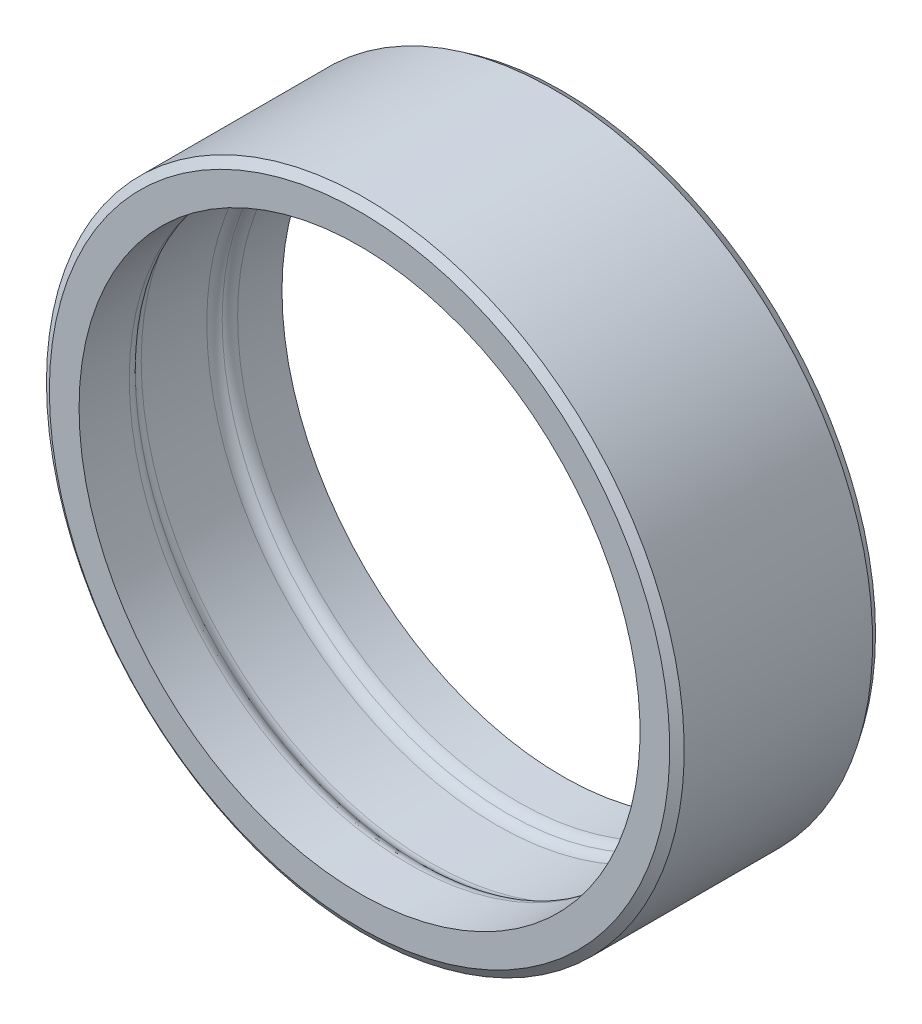
ISO-10303-21;
HEADER;
FILE_DESCRIPTION(('STEP AP214'),'2;1');
FILE_NAME('part.step','',(''),(''),'','','');
FILE_SCHEMA(('AUTOMOTIVE_DESIGN { 1 0 10303 214 1 1 1 1 }'));
ENDSEC;
DATA;
#1=APPLICATION_CONTEXT('core data for automotive mechanical design processes');
#2=APPLICATION_PROTOCOL_DEFINITION('international standard','automotive_design',2000,#1);
#3=PRODUCT_CONTEXT('',#1,'mechanical');
#4=PRODUCT('Part','Part','',(#3));
#5=PRODUCT_RELATED_PRODUCT_CATEGORY('part','',(#4));
#6=PRODUCT_DEFINITION_FORMATION('','',#4);
#7=PRODUCT_DEFINITION_CONTEXT('part definition',#1,'design');
#8=PRODUCT_DEFINITION('design','',#6,#7);
#9=PRODUCT_DEFINITION_SHAPE('','',#8);
#10=(LENGTH_UNIT() NAMED_UNIT(*) SI_UNIT(.MILLI.,.METRE.));
#11=(NAMED_UNIT(*) PLANE_ANGLE_UNIT() SI_UNIT($,.RADIAN.));
#12=(NAMED_UNIT(*) SI_UNIT($,.STERADIAN.) SOLID_ANGLE_UNIT());
#13=UNCERTAINTY_MEASURE_WITH_UNIT(LENGTH_MEASURE(1.E-05),#10,'distance_accuracy_value','');
#14=(GEOMETRIC_REPRESENTATION_CONTEXT(3) GLOBAL_UNCERTAINTY_ASSIGNED_CONTEXT((#13)) GLOBAL_UNIT_ASSIGNED_CONTEXT((#10,
#11,#12)) REPRESENTATION_CONTEXT('',''));
#15=CARTESIAN_POINT('',(0.,0.,0.));
#16=DIRECTION('',(0.,0.,1.));
#17=DIRECTION('',(1.,0.,0.));
#18=AXIS2_PLACEMENT_3D('',#15,#16,#17);
#19=CARTESIAN_POINT('',(0.,0.,0.));
#20=DIRECTION('',(0.,0.,-1.));
#21=DIRECTION('',(1.,0.,0.));
#22=AXIS2_PLACEMENT_3D('',#19,#20,#21);
#23=CYLINDRICAL_SURFACE('',#22,9.675);
#24=CARTESIAN_POINT('',(0.,0.,-7.));
#25=DIRECTION('',(0.,0.,-1.));
#26=DIRECTION('',(1.,0.,0.));
#27=AXIS2_PLACEMENT_3D('',#24,#25,#26);
#28=CIRCLE('',#27,9.675);
#29=CARTESIAN_POINT('',(-9.675,0.,-7.));
#30=VERTEX_POINT('',#29);
#31=EDGE_CURVE('E156',#30,#30,#28,.T.);
#32=ORIENTED_EDGE('',*,*,#31,.T.);
#33=DIRECTION('',(0.,0.,1.));
#34=VECTOR('',#33,1.);
#35=CARTESIAN_POINT('',(-9.675,0.,0.));
#36=LINE('',#35,#34);
#37=CARTESIAN_POINT('',(-9.675,0.,-5.46837484987988));
#38=VERTEX_POINT('',#37);
#39=EDGE_CURVE('E11',#30,#38,#36,.T.);
#40=ORIENTED_EDGE('',*,*,#39,.T.);
#41=CARTESIAN_POINT('',(0.,0.,-5.46837484987988));
#42=DIRECTION('',(0.,0.,1.));
#43=DIRECTION('',(-1.,0.,0.));
#44=AXIS2_PLACEMENT_3D('',#41,#42,#43);
#45=CIRCLE('',#44,9.675);
#46=CARTESIAN_POINT('',(9.675,0.,-5.46837484987988));
#47=VERTEX_POINT('',#46);
#48=EDGE_CURVE('E215',#38,#47,#45,.T.);
#49=ORIENTED_EDGE('',*,*,#48,.T.);
#50=CARTESIAN_POINT('',(0.,0.,-5.46837484987988));
#51=DIRECTION('',(0.,0.,1.));
#52=DIRECTION('',(-1.,0.,0.));
#53=AXIS2_PLACEMENT_3D('',#50,#51,#52);
#54=CIRCLE('',#53,9.675);
#55=EDGE_CURVE('E69',#47,#38,#54,.T.);
#56=ORIENTED_EDGE('',*,*,#55,.T.);
#57=ORIENTED_EDGE('',*,*,#39,.F.);
#58=EDGE_LOOP('',(#32,#40,#49,#56,#57));
#59=FACE_BOUND('',#58,.T.);
#60=ADVANCED_FACE('F47',(#59),#23,.F.);
#61=CARTESIAN_POINT('',(0.,0.,-5.46837484987988));
#62=DIRECTION('',(0.,0.,1.));
#63=DIRECTION('',(-1.,0.,0.));
#64=AXIS2_PLACEMENT_3D('',#61,#62,#63);
#65=TOROIDAL_SURFACE('',#64,10.175,0.5);
#66=ORIENTED_EDGE('',*,*,#55,.F.);
#67=CARTESIAN_POINT('',(10.175,0.,-5.46837484987988));
#68=DIRECTION('',(0.,1.,0.));
#69=DIRECTION('',(1.,0.,0.));
#70=AXIS2_PLACEMENT_3D('',#67,#68,#69);
#71=CIRCLE('',#70,0.5);
#72=CARTESIAN_POINT('',(9.8375,0.,-5.09946598579554));
#73=VERTEX_POINT('',#72);
#74=EDGE_CURVE('E59',#47,#73,#71,.T.);
#75=ORIENTED_EDGE('',*,*,#74,.T.);
#76=CARTESIAN_POINT('',(0.,0.,-5.09946598579554));
#77=DIRECTION('',(0.,0.,1.));
#78=DIRECTION('',(1.,0.,0.));
#79=AXIS2_PLACEMENT_3D('',#76,#77,#78);
#80=CIRCLE('',#79,9.8375);
#81=CARTESIAN_POINT('',(-9.8375,0.,-5.09946598579554));
#82=VERTEX_POINT('',#81);
#83=EDGE_CURVE('E205',#73,#82,#80,.T.);
#84=ORIENTED_EDGE('',*,*,#83,.T.);
#85=CARTESIAN_POINT('',(0.,0.,-5.09946598579554));
#86=DIRECTION('',(0.,0.,1.));
#87=DIRECTION('',(1.,0.,0.));
#88=AXIS2_PLACEMENT_3D('',#85,#86,#87);
#89=CIRCLE('',#88,9.8375);
#90=EDGE_CURVE('E204',#82,#73,#89,.T.);
#91=ORIENTED_EDGE('',*,*,#90,.T.);
#92=ORIENTED_EDGE('',*,*,#74,.F.);
#93=ORIENTED_EDGE('',*,*,#48,.F.);
#94=EDGE_LOOP('',(#66,#75,#84,#91,#92,#93));
#95=FACE_BOUND('',#94,.T.);
#96=ADVANCED_FACE('F217',(#95),#65,.T.);
#97=CARTESIAN_POINT('',(0.,0.,-4.7305571217112));
#98=DIRECTION('',(0.,0.,-1.));
#99=DIRECTION('',(1.,0.,0.));
#100=AXIS2_PLACEMENT_3D('',#97,#98,#99);
#101=TOROIDAL_SURFACE('',#100,9.5,0.5);
#102=ORIENTED_EDGE('',*,*,#90,.F.);
#103=CARTESIAN_POINT('',(-9.5,0.,-4.7305571217112));
#104=DIRECTION('',(0.,1.,0.));
#105=DIRECTION('',(-1.,0.,0.));
#106=AXIS2_PLACEMENT_3D('',#103,#104,#105);
#107=CIRCLE('',#106,0.5);
#108=CARTESIAN_POINT('',(-10.,0.,-4.7305571217112));
#109=VERTEX_POINT('',#108);
#110=EDGE_CURVE('E199',#82,#109,#107,.T.);
#111=ORIENTED_EDGE('',*,*,#110,.T.);
#112=CARTESIAN_POINT('',(0.,0.,-4.7305571217112));
#113=DIRECTION('',(0.,0.,-1.));
#114=DIRECTION('',(1.,0.,0.));
#115=AXIS2_PLACEMENT_3D('',#112,#113,#114);
#116=CIRCLE('',#115,10.);
#117=EDGE_CURVE('E142',#109,#109,#116,.T.);
#118=ORIENTED_EDGE('',*,*,#117,.F.);
#119=ORIENTED_EDGE('',*,*,#110,.F.);
#120=ORIENTED_EDGE('',*,*,#83,.F.);
#121=EDGE_LOOP('',(#102,#111,#118,#119,#120));
#122=FACE_BOUND('',#121,.T.);
#123=ADVANCED_FACE('F222',(#122),#101,.F.);
#124=CARTESIAN_POINT('',(0.,0.,-3.5));
#125=DIRECTION('',(0.,0.,-1.));
#126=DIRECTION('',(1.,0.,0.));
#127=AXIS2_PLACEMENT_3D('',#124,#125,#126);
#128=CYLINDRICAL_SURFACE('',#127,10.);
#129=CARTESIAN_POINT('',(0.,0.,-2.46837484987988));
#130=DIRECTION('',(0.,0.,1.));
#131=DIRECTION('',(-1.,0.,0.));
#132=AXIS2_PLACEMENT_3D('',#129,#130,#131);
#133=CIRCLE('',#132,10.);
#134=CARTESIAN_POINT('',(10.,0.,-2.46837484987988));
#135=VERTEX_POINT('',#134);
#136=CARTESIAN_POINT('',(-10.,0.,-2.46837484987988));
#137=VERTEX_POINT('',#136);
#138=EDGE_CURVE('E132',#135,#137,#133,.T.);
#139=ORIENTED_EDGE('',*,*,#138,.T.);
#140=DIRECTION('',(0.,0.,-1.));
#141=VECTOR('',#140,1.);
#142=CARTESIAN_POINT('',(-10.,0.,-3.5));
#143=LINE('',#142,#141);
#144=EDGE_CURVE('E139',#137,#109,#143,.T.);
#145=ORIENTED_EDGE('',*,*,#144,.T.);
#146=ORIENTED_EDGE('',*,*,#117,.T.);
#147=ORIENTED_EDGE('',*,*,#144,.F.);
#148=CARTESIAN_POINT('',(0.,0.,-2.46837484987988));
#149=DIRECTION('',(0.,0.,1.));
#150=DIRECTION('',(-1.,0.,0.));
#151=AXIS2_PLACEMENT_3D('',#148,#149,#150);
#152=CIRCLE('',#151,10.);
#153=EDGE_CURVE('E129',#137,#135,#152,.T.);
#154=ORIENTED_EDGE('',*,*,#153,.T.);
#155=EDGE_LOOP('',(#139,#145,#146,#147,#154));
#156=FACE_BOUND('',#155,.T.);
#157=ADVANCED_FACE('F141',(#156),#128,.F.);
#158=CARTESIAN_POINT('',(0.,0.,-2.46837484987988));
#159=DIRECTION('',(0.,0.,-1.));
#160=DIRECTION('',(-1.,0.,0.));
#161=AXIS2_PLACEMENT_3D('',#158,#159,#160);
#162=TOROIDAL_SURFACE('',#161,9.5,0.5);
#163=ORIENTED_EDGE('',*,*,#138,.F.);
#164=CARTESIAN_POINT('',(9.5,0.,-2.46837484987988));
#165=DIRECTION('',(0.,-1.,0.));
#166=DIRECTION('',(1.,0.,0.));
#167=AXIS2_PLACEMENT_3D('',#164,#165,#166);
#168=CIRCLE('',#167,0.5);
#169=CARTESIAN_POINT('',(9.8375,0.,-2.09946598579554));
#170=VERTEX_POINT('',#169);
#171=EDGE_CURVE('E134',#135,#170,#168,.T.);
#172=ORIENTED_EDGE('',*,*,#171,.T.);
#173=CARTESIAN_POINT('',(0.,0.,-2.09946598579554));
#174=DIRECTION('',(0.,0.,1.));
#175=DIRECTION('',(1.,0.,0.));
#176=AXIS2_PLACEMENT_3D('',#173,#174,#175);
#177=CIRCLE('',#176,9.8375);
#178=CARTESIAN_POINT('',(-9.8375,0.,-2.09946598579554));
#179=VERTEX_POINT('',#178);
#180=EDGE_CURVE('E153',#170,#179,#177,.T.);
#181=ORIENTED_EDGE('',*,*,#180,.T.);
#182=CARTESIAN_POINT('',(0.,0.,-2.09946598579554));
#183=DIRECTION('',(0.,0.,1.));
#184=DIRECTION('',(1.,0.,0.));
#185=AXIS2_PLACEMENT_3D('',#182,#183,#184);
#186=CIRCLE('',#185,9.8375);
#187=EDGE_CURVE('E189',#179,#170,#186,.T.);
#188=ORIENTED_EDGE('',*,*,#187,.T.);
#189=ORIENTED_EDGE('',*,*,#171,.F.);
#190=ORIENTED_EDGE('',*,*,#153,.F.);
#191=EDGE_LOOP('',(#163,#172,#181,#188,#189,#190));
#192=FACE_BOUND('',#191,.T.);
#193=ADVANCED_FACE('F131',(#192),#162,.F.);
#194=CARTESIAN_POINT('',(0.,0.,0.));
#195=DIRECTION('',(0.,0.,-1.));
#196=DIRECTION('',(1.,0.,0.));
#197=AXIS2_PLACEMENT_3D('',#194,#195,#196);
#198=CYLINDRICAL_SURFACE('',#197,9.675);
#199=CARTESIAN_POINT('',(0.,0.,-1.7305571217112));
#200=DIRECTION('',(0.,0.,-1.));
#201=DIRECTION('',(1.,0.,0.));
#202=AXIS2_PLACEMENT_3D('',#199,#200,#201);
#203=CIRCLE('',#202,9.675);
#204=CARTESIAN_POINT('',(-9.675,0.,-1.7305571217112));
#205=VERTEX_POINT('',#204);
#206=EDGE_CURVE('E158',#205,#205,#203,.T.);
#207=ORIENTED_EDGE('',*,*,#206,.T.);
#208=DIRECTION('',(0.,0.,1.));
#209=VECTOR('',#208,1.);
#210=CARTESIAN_POINT('',(-9.675,0.,0.));
#211=LINE('',#210,#209);
#212=CARTESIAN_POINT('',(-9.675,0.,0.));
#213=VERTEX_POINT('',#212);
#214=EDGE_CURVE('E150',#205,#213,#211,.T.);
#215=ORIENTED_EDGE('',*,*,#214,.T.);
#216=CARTESIAN_POINT('',(0.,0.,0.));
#217=DIRECTION('',(0.,0.,-1.));
#218=DIRECTION('',(1.,0.,0.));
#219=AXIS2_PLACEMENT_3D('',#216,#217,#218);
#220=CIRCLE('',#219,9.675);
#221=EDGE_CURVE('E180',#213,#213,#220,.T.);
#222=ORIENTED_EDGE('',*,*,#221,.F.);
#223=ORIENTED_EDGE('',*,*,#214,.F.);
#224=EDGE_LOOP('',(#207,#215,#222,#223));
#225=FACE_BOUND('',#224,.T.);
#226=ADVANCED_FACE('F267',(#225),#198,.F.);
#227=CARTESIAN_POINT('',(0.,0.,-1.7305571217112));
#228=DIRECTION('',(0.,0.,-1.));
#229=DIRECTION('',(1.,0.,0.));
#230=AXIS2_PLACEMENT_3D('',#227,#228,#229);
#231=TOROIDAL_SURFACE('',#230,10.175,0.5);
#232=ORIENTED_EDGE('',*,*,#206,.F.);
#233=CARTESIAN_POINT('',(-10.175,0.,-1.7305571217112));
#234=DIRECTION('',(0.,1.,0.));
#235=DIRECTION('',(-1.,0.,0.));
#236=AXIS2_PLACEMENT_3D('',#233,#234,#235);
#237=CIRCLE('',#236,0.5);
#238=EDGE_CURVE('E164',#205,#179,#237,.T.);
#239=ORIENTED_EDGE('',*,*,#238,.T.);
#240=ORIENTED_EDGE('',*,*,#180,.F.);
#241=ORIENTED_EDGE('',*,*,#187,.F.);
#242=ORIENTED_EDGE('',*,*,#238,.F.);
#243=EDGE_LOOP('',(#232,#239,#240,#241,#242));
#244=FACE_BOUND('',#243,.T.);
#245=ADVANCED_FACE('F265',(#244),#231,.T.);
#246=CARTESIAN_POINT('',(0.,0.,-7.));
#247=DIRECTION('',(0.,0.,-1.));
#248=DIRECTION('',(1.,0.,0.));
#249=AXIS2_PLACEMENT_3D('',#246,#247,#248);
#250=PLANE('',#249);
#251=ORIENTED_EDGE('',*,*,#31,.F.);
#252=EDGE_LOOP('',(#251));
#253=FACE_BOUND('',#252,.T.);
#254=CARTESIAN_POINT('',(0.,0.,-7.));
#255=DIRECTION('',(0.,0.,-1.));
#256=DIRECTION('',(1.,0.,0.));
#257=AXIS2_PLACEMENT_3D('',#254,#255,#256);
#258=CIRCLE('',#257,10.8);
#259=CARTESIAN_POINT('',(-10.8,0.,-7.));
#260=VERTEX_POINT('',#259);
#261=EDGE_CURVE('E177',#260,#260,#258,.T.);
#262=ORIENTED_EDGE('',*,*,#261,.T.);
#263=EDGE_LOOP('',(#262));
#264=FACE_BOUND('',#263,.T.);
#265=ADVANCED_FACE('F259',(#253,#264),#250,.T.);
#266=CARTESIAN_POINT('',(0.,0.,-6.85));
#267=DIRECTION('',(0.,0.,1.));
#268=DIRECTION('',(1.,0.,0.));
#269=AXIS2_PLACEMENT_3D('',#266,#267,#268);
#270=CONICAL_SURFACE('',#269,10.9,0.588002603547567);
#271=ORIENTED_EDGE('',*,*,#261,.F.);
#272=DIRECTION('',(-0.554700196225229,0.,0.832050294337844));
#273=VECTOR('',#272,1.);
#274=CARTESIAN_POINT('',(-10.9,0.,-6.85));
#275=LINE('',#274,#273);
#276=CARTESIAN_POINT('',(-11.,0.,-6.7));
#277=VERTEX_POINT('',#276);
#278=EDGE_CURVE('E182',#260,#277,#275,.T.);
#279=ORIENTED_EDGE('',*,*,#278,.T.);
#280=CARTESIAN_POINT('',(0.,0.,-6.7));
#281=DIRECTION('',(0.,0.,1.));
#282=DIRECTION('',(1.,0.,0.));
#283=AXIS2_PLACEMENT_3D('',#280,#281,#282);
#284=CIRCLE('',#283,11.);
#285=EDGE_CURVE('E170',#277,#277,#284,.T.);
#286=ORIENTED_EDGE('',*,*,#285,.F.);
#287=ORIENTED_EDGE('',*,*,#278,.F.);
#288=EDGE_LOOP('',(#271,#279,#286,#287));
#289=FACE_BOUND('',#288,.T.);
#290=ADVANCED_FACE('F256',(#289),#270,.T.);
#291=CARTESIAN_POINT('',(0.,0.,0.));
#292=DIRECTION('',(0.,0.,-1.));
#293=DIRECTION('',(1.,0.,0.));
#294=AXIS2_PLACEMENT_3D('',#291,#292,#293);
#295=PLANE('',#294);
#296=ORIENTED_EDGE('',*,*,#221,.T.);
#297=EDGE_LOOP('',(#296));
#298=FACE_BOUND('',#297,.T.);
#299=CARTESIAN_POINT('',(0.,0.,0.));
#300=DIRECTION('',(0.,0.,1.));
#301=DIRECTION('',(1.,0.,0.));
#302=AXIS2_PLACEMENT_3D('',#299,#300,#301);
#303=CIRCLE('',#302,10.7);
#304=CARTESIAN_POINT('',(-10.7,0.,0.));
#305=VERTEX_POINT('',#304);
#306=EDGE_CURVE('E167',#305,#305,#303,.T.);
#307=ORIENTED_EDGE('',*,*,#306,.T.);
#308=EDGE_LOOP('',(#307));
#309=FACE_BOUND('',#308,.T.);
#310=ADVANCED_FACE('F249',(#298,#309),#295,.F.);
#311=CARTESIAN_POINT('',(0.,0.,0.));
#312=DIRECTION('',(0.,0.,-1.));
#313=DIRECTION('',(1.,0.,0.));
#314=AXIS2_PLACEMENT_3D('',#311,#312,#313);
#315=CYLINDRICAL_SURFACE('',#314,11.);
#316=ORIENTED_EDGE('',*,*,#285,.T.);
#317=DIRECTION('',(0.,0.,1.));
#318=VECTOR('',#317,1.);
#319=CARTESIAN_POINT('',(-11.,0.,0.));
#320=LINE('',#319,#318);
#321=CARTESIAN_POINT('',(-11.,0.,-0.2));
#322=VERTEX_POINT('',#321);
#323=EDGE_CURVE('E171',#277,#322,#320,.T.);
#324=ORIENTED_EDGE('',*,*,#323,.T.);
#325=CARTESIAN_POINT('',(0.,0.,-0.2));
#326=DIRECTION('',(0.,0.,-1.));
#327=DIRECTION('',(1.,0.,0.));
#328=AXIS2_PLACEMENT_3D('',#325,#326,#327);
#329=CIRCLE('',#328,11.);
#330=EDGE_CURVE('E166',#322,#322,#329,.T.);
#331=ORIENTED_EDGE('',*,*,#330,.T.);
#332=ORIENTED_EDGE('',*,*,#323,.F.);
#333=EDGE_LOOP('',(#316,#324,#331,#332));
#334=FACE_BOUND('',#333,.T.);
#335=ADVANCED_FACE('F253',(#334),#315,.T.);
#336=CARTESIAN_POINT('',(0.,0.,-0.1));
#337=DIRECTION('',(0.,0.,-1.));
#338=DIRECTION('',(1.,0.,0.));
#339=AXIS2_PLACEMENT_3D('',#336,#337,#338);
#340=CONICAL_SURFACE('',#339,10.85,0.982793723247329);
#341=ORIENTED_EDGE('',*,*,#330,.F.);
#342=DIRECTION('',(0.832050294337844,0.,0.554700196225229));
#343=VECTOR('',#342,1.);
#344=CARTESIAN_POINT('',(-10.85,0.,-0.1));
#345=LINE('',#344,#343);
#346=EDGE_CURVE('E163',#322,#305,#345,.T.);
#347=ORIENTED_EDGE('',*,*,#346,.T.);
#348=ORIENTED_EDGE('',*,*,#306,.F.);
#349=ORIENTED_EDGE('',*,*,#346,.F.);
#350=EDGE_LOOP('',(#341,#347,#348,#349));
#351=FACE_BOUND('',#350,.T.);
#352=ADVANCED_FACE('F252',(#351),#340,.T.);
#353=CLOSED_SHELL('',(#60,#96,#123,#157,#193,#226,#245,#265,#290,#310,#335,#352));
#354=MANIFOLD_SOLID_BREP('B2',#353);
#355=ADVANCED_BREP_SHAPE_REPRESENTATION('',(#18,#354),#14);
#356=SHAPE_DEFINITION_REPRESENTATION(#9,#355);
ENDSEC;
END-ISO-10303-21;
